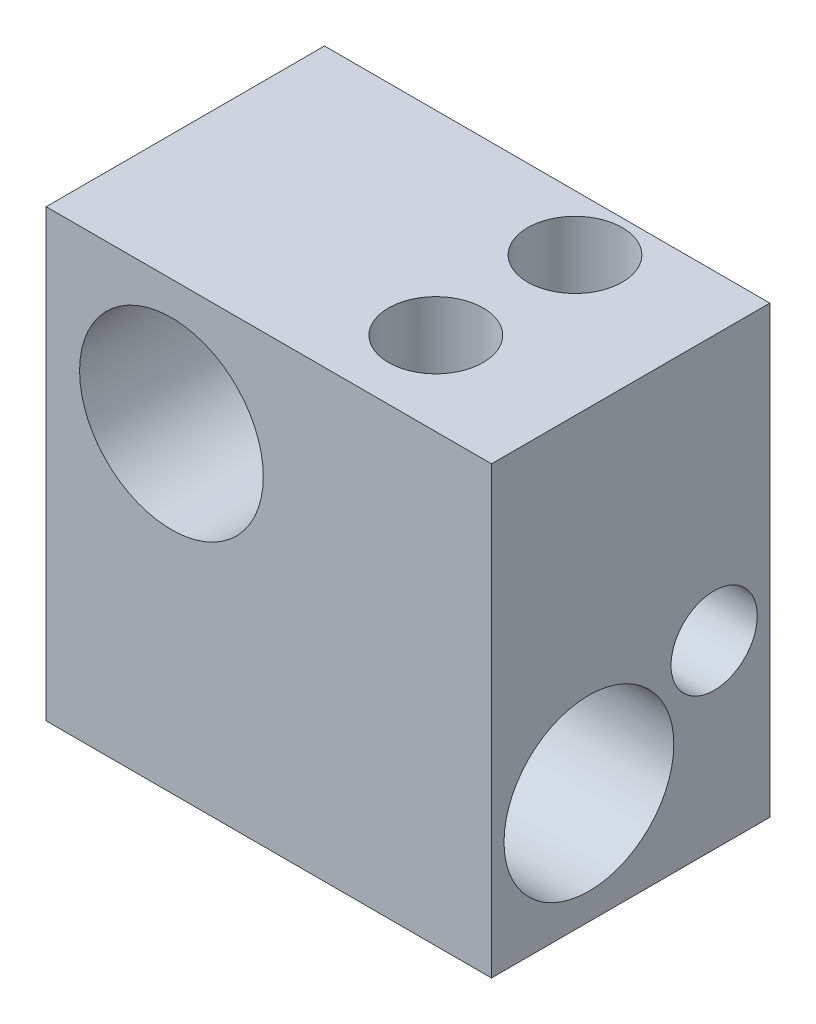
ISO-10303-21;
HEADER;
FILE_DESCRIPTION(('STEP AP214'),'2;1');
FILE_NAME('part.step','',(''),(''),'','','');
FILE_SCHEMA(('AUTOMOTIVE_DESIGN { 1 0 10303 214 1 1 1 1 }'));
ENDSEC;
DATA;
#1=APPLICATION_CONTEXT('core data for automotive mechanical design processes');
#2=APPLICATION_PROTOCOL_DEFINITION('international standard','automotive_design',2000,#1);
#3=PRODUCT_CONTEXT('',#1,'mechanical');
#4=PRODUCT('Part','Part','',(#3));
#5=PRODUCT_RELATED_PRODUCT_CATEGORY('part','',(#4));
#6=PRODUCT_DEFINITION_FORMATION('','',#4);
#7=PRODUCT_DEFINITION_CONTEXT('part definition',#1,'design');
#8=PRODUCT_DEFINITION('design','',#6,#7);
#9=PRODUCT_DEFINITION_SHAPE('','',#8);
#10=(LENGTH_UNIT() NAMED_UNIT(*) SI_UNIT(.MILLI.,.METRE.));
#11=(NAMED_UNIT(*) PLANE_ANGLE_UNIT() SI_UNIT($,.RADIAN.));
#12=(NAMED_UNIT(*) SI_UNIT($,.STERADIAN.) SOLID_ANGLE_UNIT());
#13=UNCERTAINTY_MEASURE_WITH_UNIT(LENGTH_MEASURE(1.E-05),#10,'distance_accuracy_value','');
#14=(GEOMETRIC_REPRESENTATION_CONTEXT(3) GLOBAL_UNCERTAINTY_ASSIGNED_CONTEXT((#13)) GLOBAL_UNIT_ASSIGNED_CONTEXT((#10,
#11,#12)) REPRESENTATION_CONTEXT('',''));
#15=CARTESIAN_POINT('',(0.,0.,0.));
#16=DIRECTION('',(0.,0.,1.));
#17=DIRECTION('',(1.,0.,0.));
#18=AXIS2_PLACEMENT_3D('',#15,#16,#17);
#19=CARTESIAN_POINT('',(0.,0.,10.));
#20=DIRECTION('',(1.,0.,0.));
#21=DIRECTION('',(0.,0.,-1.));
#22=AXIS2_PLACEMENT_3D('',#19,#20,#21);
#23=PLANE('',#22);
#24=CARTESIAN_POINT('',(0.,6.5,2.));
#25=DIRECTION('',(1.,0.,0.));
#26=DIRECTION('',(0.,0.,-1.));
#27=AXIS2_PLACEMENT_3D('',#24,#25,#26);
#28=CIRCLE('',#27,1.55);
#29=CARTESIAN_POINT('',(0.,6.5,0.450000000000003));
#30=VERTEX_POINT('',#29);
#31=EDGE_CURVE('E222',#30,#30,#28,.T.);
#32=ORIENTED_EDGE('',*,*,#31,.T.);
#33=EDGE_LOOP('',(#32));
#34=FACE_BOUND('',#33,.T.);
#35=CARTESIAN_POINT('',(0.,4.,6.5));
#36=DIRECTION('',(1.,0.,0.));
#37=DIRECTION('',(0.,0.,-1.));
#38=AXIS2_PLACEMENT_3D('',#35,#36,#37);
#39=CIRCLE('',#38,3.05);
#40=CARTESIAN_POINT('',(0.,4.,3.45));
#41=VERTEX_POINT('',#40);
#42=EDGE_CURVE('E213',#41,#41,#39,.T.);
#43=ORIENTED_EDGE('',*,*,#42,.T.);
#44=EDGE_LOOP('',(#43));
#45=FACE_BOUND('',#44,.T.);
#46=DIRECTION('',(0.,-1.,0.));
#47=VECTOR('',#46,1.);
#48=CARTESIAN_POINT('',(0.,0.,0.));
#49=LINE('',#48,#47);
#50=CARTESIAN_POINT('',(0.,16.,0.));
#51=VERTEX_POINT('',#50);
#52=CARTESIAN_POINT('',(0.,0.,0.));
#53=VERTEX_POINT('',#52);
#54=EDGE_CURVE('E189',#51,#53,#49,.T.);
#55=ORIENTED_EDGE('',*,*,#54,.T.);
#56=DIRECTION('',(0.,0.,-1.));
#57=VECTOR('',#56,1.);
#58=CARTESIAN_POINT('',(0.,0.,10.));
#59=LINE('',#58,#57);
#60=CARTESIAN_POINT('',(0.,0.,10.));
#61=VERTEX_POINT('',#60);
#62=EDGE_CURVE('E115',#61,#53,#59,.T.);
#63=ORIENTED_EDGE('',*,*,#62,.F.);
#64=DIRECTION('',(0.,-1.,0.));
#65=VECTOR('',#64,1.);
#66=CARTESIAN_POINT('',(0.,0.,10.));
#67=LINE('',#66,#65);
#68=CARTESIAN_POINT('',(0.,16.,10.));
#69=VERTEX_POINT('',#68);
#70=EDGE_CURVE('E196',#69,#61,#67,.T.);
#71=ORIENTED_EDGE('',*,*,#70,.F.);
#72=DIRECTION('',(0.,0.,-1.));
#73=VECTOR('',#72,1.);
#74=CARTESIAN_POINT('',(0.,16.,10.));
#75=LINE('',#74,#73);
#76=EDGE_CURVE('E200',#69,#51,#75,.T.);
#77=ORIENTED_EDGE('',*,*,#76,.T.);
#78=EDGE_LOOP('',(#55,#63,#71,#77));
#79=FACE_BOUND('',#78,.T.);
#80=ADVANCED_FACE('F34',(#34,#45,#79),#23,.F.);
#81=CARTESIAN_POINT('',(0.,0.,10.));
#82=DIRECTION('',(0.,1.,0.));
#83=DIRECTION('',(0.,0.,1.));
#84=AXIS2_PLACEMENT_3D('',#81,#82,#83);
#85=PLANE('',#84);
#86=DIRECTION('',(1.,0.,0.));
#87=VECTOR('',#86,1.);
#88=CARTESIAN_POINT('',(0.,0.,0.));
#89=LINE('',#88,#87);
#90=CARTESIAN_POINT('',(16.,0.,0.));
#91=VERTEX_POINT('',#90);
#92=EDGE_CURVE('E179',#53,#91,#89,.T.);
#93=ORIENTED_EDGE('',*,*,#92,.T.);
#94=DIRECTION('',(0.,0.,-1.));
#95=VECTOR('',#94,1.);
#96=CARTESIAN_POINT('',(16.,0.,10.));
#97=LINE('',#96,#95);
#98=CARTESIAN_POINT('',(16.,0.,10.));
#99=VERTEX_POINT('',#98);
#100=EDGE_CURVE('E181',#99,#91,#97,.T.);
#101=ORIENTED_EDGE('',*,*,#100,.F.);
#102=DIRECTION('',(1.,0.,0.));
#103=VECTOR('',#102,1.);
#104=CARTESIAN_POINT('',(0.,0.,10.));
#105=LINE('',#104,#103);
#106=EDGE_CURVE('E91',#61,#99,#105,.T.);
#107=ORIENTED_EDGE('',*,*,#106,.F.);
#108=ORIENTED_EDGE('',*,*,#62,.T.);
#109=EDGE_LOOP('',(#93,#101,#107,#108));
#110=FACE_BOUND('',#109,.T.);
#111=ADVANCED_FACE('F172',(#110),#85,.F.);
#112=CARTESIAN_POINT('',(16.,0.,10.));
#113=DIRECTION('',(-1.,0.,0.));
#114=DIRECTION('',(0.,0.,1.));
#115=AXIS2_PLACEMENT_3D('',#112,#113,#114);
#116=PLANE('',#115);
#117=CARTESIAN_POINT('',(16.,6.5,2.));
#118=DIRECTION('',(1.,0.,0.));
#119=DIRECTION('',(0.,0.,-1.));
#120=AXIS2_PLACEMENT_3D('',#117,#118,#119);
#121=CIRCLE('',#120,1.55);
#122=CARTESIAN_POINT('',(16.,6.5,0.450000000000002));
#123=VERTEX_POINT('',#122);
#124=EDGE_CURVE('E146',#123,#123,#121,.T.);
#125=ORIENTED_EDGE('',*,*,#124,.F.);
#126=EDGE_LOOP('',(#125));
#127=FACE_BOUND('',#126,.T.);
#128=CARTESIAN_POINT('',(16.,4.,6.5));
#129=DIRECTION('',(1.,0.,0.));
#130=DIRECTION('',(0.,0.,-1.));
#131=AXIS2_PLACEMENT_3D('',#128,#129,#130);
#132=CIRCLE('',#131,3.05);
#133=CARTESIAN_POINT('',(16.,4.,3.45));
#134=VERTEX_POINT('',#133);
#135=EDGE_CURVE('E219',#134,#134,#132,.T.);
#136=ORIENTED_EDGE('',*,*,#135,.F.);
#137=EDGE_LOOP('',(#136));
#138=FACE_BOUND('',#137,.T.);
#139=DIRECTION('',(0.,1.,0.));
#140=VECTOR('',#139,1.);
#141=CARTESIAN_POINT('',(16.,0.,0.));
#142=LINE('',#141,#140);
#143=CARTESIAN_POINT('',(16.,16.,0.));
#144=VERTEX_POINT('',#143);
#145=EDGE_CURVE('E188',#91,#144,#142,.T.);
#146=ORIENTED_EDGE('',*,*,#145,.T.);
#147=DIRECTION('',(0.,0.,-1.));
#148=VECTOR('',#147,1.);
#149=CARTESIAN_POINT('',(16.,16.,10.));
#150=LINE('',#149,#148);
#151=CARTESIAN_POINT('',(16.,16.,10.));
#152=VERTEX_POINT('',#151);
#153=EDGE_CURVE('E194',#152,#144,#150,.T.);
#154=ORIENTED_EDGE('',*,*,#153,.F.);
#155=DIRECTION('',(0.,1.,0.));
#156=VECTOR('',#155,1.);
#157=CARTESIAN_POINT('',(16.,0.,10.));
#158=LINE('',#157,#156);
#159=EDGE_CURVE('E193',#99,#152,#158,.T.);
#160=ORIENTED_EDGE('',*,*,#159,.F.);
#161=ORIENTED_EDGE('',*,*,#100,.T.);
#162=EDGE_LOOP('',(#146,#154,#160,#161));
#163=FACE_BOUND('',#162,.T.);
#164=ADVANCED_FACE('F169',(#127,#138,#163),#116,.F.);
#165=CARTESIAN_POINT('',(0.,16.,10.));
#166=DIRECTION('',(0.,-1.,0.));
#167=DIRECTION('',(0.,0.,-1.));
#168=AXIS2_PLACEMENT_3D('',#165,#166,#167);
#169=PLANE('',#168);
#170=CARTESIAN_POINT('',(11.,16.,2.));
#171=DIRECTION('',(0.,1.,0.));
#172=DIRECTION('',(0.,0.,1.));
#173=AXIS2_PLACEMENT_3D('',#170,#171,#172);
#174=CIRCLE('',#173,1.69999999999999);
#175=CARTESIAN_POINT('',(11.,16.,3.69999999999999));
#176=VERTEX_POINT('',#175);
#177=EDGE_CURVE('E109',#176,#176,#174,.T.);
#178=ORIENTED_EDGE('',*,*,#177,.F.);
#179=EDGE_LOOP('',(#178));
#180=FACE_BOUND('',#179,.T.);
#181=CARTESIAN_POINT('',(11.,16.,7.));
#182=DIRECTION('',(0.,1.,0.));
#183=DIRECTION('',(0.,0.,1.));
#184=AXIS2_PLACEMENT_3D('',#181,#182,#183);
#185=CIRCLE('',#184,1.69999999999999);
#186=CARTESIAN_POINT('',(11.,16.,8.69999999999999));
#187=VERTEX_POINT('',#186);
#188=EDGE_CURVE('E147',#187,#187,#185,.T.);
#189=ORIENTED_EDGE('',*,*,#188,.F.);
#190=EDGE_LOOP('',(#189));
#191=FACE_BOUND('',#190,.T.);
#192=DIRECTION('',(-1.,0.,0.));
#193=VECTOR('',#192,1.);
#194=CARTESIAN_POINT('',(0.,16.,0.));
#195=LINE('',#194,#193);
#196=EDGE_CURVE('E83',#144,#51,#195,.T.);
#197=ORIENTED_EDGE('',*,*,#196,.T.);
#198=ORIENTED_EDGE('',*,*,#76,.F.);
#199=DIRECTION('',(-1.,0.,0.));
#200=VECTOR('',#199,1.);
#201=CARTESIAN_POINT('',(0.,16.,10.));
#202=LINE('',#201,#200);
#203=EDGE_CURVE('E62',#152,#69,#202,.T.);
#204=ORIENTED_EDGE('',*,*,#203,.F.);
#205=ORIENTED_EDGE('',*,*,#153,.T.);
#206=EDGE_LOOP('',(#197,#198,#204,#205));
#207=FACE_BOUND('',#206,.T.);
#208=ADVANCED_FACE('F162',(#180,#191,#207),#169,.F.);
#209=CARTESIAN_POINT('',(0.,0.,10.));
#210=DIRECTION('',(0.,0.,-1.));
#211=DIRECTION('',(-1.,0.,0.));
#212=AXIS2_PLACEMENT_3D('',#209,#210,#211);
#213=PLANE('',#212);
#214=CARTESIAN_POINT('',(4.5,11.5,10.));
#215=DIRECTION('',(0.,0.,1.));
#216=DIRECTION('',(1.,0.,0.));
#217=AXIS2_PLACEMENT_3D('',#214,#215,#216);
#218=CIRCLE('',#217,3.3);
#219=CARTESIAN_POINT('',(7.8,11.5,10.));
#220=VERTEX_POINT('',#219);
#221=EDGE_CURVE('E209',#220,#220,#218,.T.);
#222=ORIENTED_EDGE('',*,*,#221,.F.);
#223=EDGE_LOOP('',(#222));
#224=FACE_BOUND('',#223,.T.);
#225=ORIENTED_EDGE('',*,*,#70,.T.);
#226=ORIENTED_EDGE('',*,*,#106,.T.);
#227=ORIENTED_EDGE('',*,*,#159,.T.);
#228=ORIENTED_EDGE('',*,*,#203,.T.);
#229=EDGE_LOOP('',(#225,#226,#227,#228));
#230=FACE_BOUND('',#229,.T.);
#231=ADVANCED_FACE('F159',(#224,#230),#213,.F.);
#232=CARTESIAN_POINT('',(0.,0.,0.));
#233=DIRECTION('',(0.,0.,-1.));
#234=DIRECTION('',(-1.,0.,0.));
#235=AXIS2_PLACEMENT_3D('',#232,#233,#234);
#236=PLANE('',#235);
#237=CARTESIAN_POINT('',(4.5,11.5,0.));
#238=DIRECTION('',(0.,0.,1.));
#239=DIRECTION('',(1.,0.,0.));
#240=AXIS2_PLACEMENT_3D('',#237,#238,#239);
#241=CIRCLE('',#240,3.3);
#242=CARTESIAN_POINT('',(7.8,11.5,0.));
#243=VERTEX_POINT('',#242);
#244=EDGE_CURVE('E206',#243,#243,#241,.T.);
#245=ORIENTED_EDGE('',*,*,#244,.T.);
#246=EDGE_LOOP('',(#245));
#247=FACE_BOUND('',#246,.T.);
#248=ORIENTED_EDGE('',*,*,#54,.F.);
#249=ORIENTED_EDGE('',*,*,#196,.F.);
#250=ORIENTED_EDGE('',*,*,#145,.F.);
#251=ORIENTED_EDGE('',*,*,#92,.F.);
#252=EDGE_LOOP('',(#248,#249,#250,#251));
#253=FACE_BOUND('',#252,.T.);
#254=ADVANCED_FACE('F157',(#247,#253),#236,.T.);
#255=CARTESIAN_POINT('',(4.5,11.5,10.));
#256=DIRECTION('',(0.,0.,1.));
#257=DIRECTION('',(1.,0.,0.));
#258=AXIS2_PLACEMENT_3D('',#255,#256,#257);
#259=CYLINDRICAL_SURFACE('',#258,3.3);
#260=ORIENTED_EDGE('',*,*,#244,.F.);
#261=EDGE_LOOP('',(#260));
#262=FACE_BOUND('',#261,.T.);
#263=ORIENTED_EDGE('',*,*,#221,.T.);
#264=EDGE_LOOP('',(#263));
#265=FACE_BOUND('',#264,.T.);
#266=ADVANCED_FACE('F153',(#262,#265),#259,.F.);
#267=CARTESIAN_POINT('',(16.,4.,6.5));
#268=DIRECTION('',(1.,0.,0.));
#269=DIRECTION('',(0.,0.,-1.));
#270=AXIS2_PLACEMENT_3D('',#267,#268,#269);
#271=CYLINDRICAL_SURFACE('',#270,3.05);
#272=CARTESIAN_POINT('',(11.,6.11246301742777,8.69999999999999));
#273=CARTESIAN_POINT('',(11.079528292114,6.11246521704666,8.69999880663125));
#274=CARTESIAN_POINT('',(11.1590626536137,6.11837709360835,8.69436634365375));
#275=CARTESIAN_POINT('',(11.3151203009329,6.14088413708846,8.67240519859406));
#276=CARTESIAN_POINT('',(11.3916378112338,6.15749883107021,8.65605696485787));
#277=CARTESIAN_POINT('',(11.5387751049102,6.19855788811439,8.61416202924386));
#278=CARTESIAN_POINT('',(11.6094515040304,6.22291216169066,8.58872076598859));
#279=CARTESIAN_POINT('',(11.7451636340388,6.2768644990575,8.52977531960098));
#280=CARTESIAN_POINT('',(11.8101958631759,6.30646578403713,8.49626617897));
#281=CARTESIAN_POINT('',(11.9625058895438,6.38276584472862,8.40521710895298));
#282=CARTESIAN_POINT('',(12.0465534873438,6.43114532893025,8.34366111778082));
#283=CARTESIAN_POINT('',(12.2018539996193,6.52914577283632,8.20676312037032));
#284=CARTESIAN_POINT('',(12.2730863231075,6.57876858708926,8.13139931361466));
#285=CARTESIAN_POINT('',(12.4018464546333,6.67554138933424,7.96734673095226));
#286=CARTESIAN_POINT('',(12.4592853829597,6.72267388964667,7.87857724132457));
#287=CARTESIAN_POINT('',(12.5575415393918,6.81042296670274,7.68946469682761));
#288=CARTESIAN_POINT('',(12.5983941357671,6.85105329514796,7.58914686035655));
#289=CARTESIAN_POINT('',(12.6535101455393,6.91429007678262,7.40370552398925));
#290=CARTESIAN_POINT('',(12.671738304028,6.93889171536477,7.32043563644801));
#291=CARTESIAN_POINT('',(12.6955057504751,6.98113370461356,7.15038014182077));
#292=CARTESIAN_POINT('',(12.7010530909569,6.99877846711341,7.06359680149102));
#293=CARTESIAN_POINT('',(12.6986124283513,7.02642753294553,6.88871235423095));
#294=CARTESIAN_POINT('',(12.6905828288487,7.03640821912031,6.80060802022368));
#295=CARTESIAN_POINT('',(12.6607540185029,7.04864142539075,6.62620672537741));
#296=CARTESIAN_POINT('',(12.6389539614247,7.05089347048402,6.53990987595039));
#297=CARTESIAN_POINT('',(12.58361183566,7.04852924800228,6.37607526733101));
#298=CARTESIAN_POINT('',(12.5507057179934,7.04424806801717,6.29831536252761));
#299=CARTESIAN_POINT('',(12.4739888344927,7.0306510828756,6.14887335927377));
#300=CARTESIAN_POINT('',(12.4301761928093,7.02133441132504,6.07719230919201));
#301=CARTESIAN_POINT('',(12.3300495489403,6.99857575805711,5.93756806307858));
#302=CARTESIAN_POINT('',(12.2731684968729,6.98493019979587,5.87006579594821));
#303=CARTESIAN_POINT('',(12.1499047478196,6.95573389097036,5.74483125871357));
#304=CARTESIAN_POINT('',(12.083516653548,6.94018205891422,5.68710457926041));
#305=CARTESIAN_POINT('',(11.9363801181384,6.90788541207189,5.57792262875148));
#306=CARTESIAN_POINT('',(11.8548816903996,6.89115627174879,5.52746865366277));
#307=CARTESIAN_POINT('',(11.6841311855808,6.86054243141176,5.4407926754854));
#308=CARTESIAN_POINT('',(11.5948799232641,6.84665743301417,5.40456917908717));
#309=CARTESIAN_POINT('',(11.4111970273088,6.82411577992966,5.34769171207569));
#310=CARTESIAN_POINT('',(11.3167832631293,6.81544219905549,5.32698728218171));
#311=CARTESIAN_POINT('',(11.1254647779462,6.80486147604216,5.30189766698735));
#312=CARTESIAN_POINT('',(11.0285617221608,6.80294992334307,5.29750184424141));
#313=CARTESIAN_POINT('',(10.8428385303602,6.80611754199839,5.30492351648954));
#314=CARTESIAN_POINT('',(10.7539586678158,6.81068169859903,5.31554634499857));
#315=CARTESIAN_POINT('',(10.5793763545709,6.82513614190086,5.35045338371066));
#316=CARTESIAN_POINT('',(10.4936746091361,6.83502760332955,5.37474060711116));
#317=CARTESIAN_POINT('',(10.3269117113306,6.85872202560501,5.43637495339453));
#318=CARTESIAN_POINT('',(10.2458936868882,6.87255596848563,5.47382609194977));
#319=CARTESIAN_POINT('',(10.0909383208469,6.90213194711119,5.5607275277258));
#320=CARTESIAN_POINT('',(10.0170040152766,6.91787479450734,5.61018293808523));
#321=CARTESIAN_POINT('',(9.87231802137184,6.95034526170827,5.72428055641386));
#322=CARTESIAN_POINT('',(9.80225100699768,6.96705524547497,5.78979957867765));
#323=CARTESIAN_POINT('',(9.67382864707653,6.99754129352491,5.93208144126689));
#324=CARTESIAN_POINT('',(9.61547351412429,7.01131730455079,6.00884448565076));
#325=CARTESIAN_POINT('',(9.51255251487534,7.03334033550922,6.17132974724012));
#326=CARTESIAN_POINT('',(9.46791775320684,7.04161523089308,6.25700421112762));
#327=CARTESIAN_POINT('',(9.39374404126914,7.050604666509,6.43500750946291));
#328=CARTESIAN_POINT('',(9.3641920460077,7.05132575056311,6.5273305144853));
#329=CARTESIAN_POINT('',(9.32320482779211,7.04418985049511,6.70668203006624));
#330=CARTESIAN_POINT('',(9.31035870384708,7.03711214325876,6.79342145747231));
#331=CARTESIAN_POINT('',(9.29810147563808,7.01532115680955,6.96687529372333));
#332=CARTESIAN_POINT('',(9.29868872327855,7.00060881448105,7.05358970433211));
#333=CARTESIAN_POINT('',(9.3124449362777,6.96466819995405,7.22135298471635));
#334=CARTESIAN_POINT('',(9.32516776202245,6.94368903511258,7.30249374719761));
#335=CARTESIAN_POINT('',(9.36154830217017,6.89599211310626,7.46049351612934));
#336=CARTESIAN_POINT('',(9.38520845599848,6.86927307645147,7.53735156308978));
#337=CARTESIAN_POINT('',(9.44485454495917,6.80871934941205,7.69209957936243));
#338=CARTESIAN_POINT('',(9.48175140399204,6.77446261778025,7.76947050297494));
#339=CARTESIAN_POINT('',(9.56576526861032,6.70230757727452,7.9166025137268));
#340=CARTESIAN_POINT('',(9.61289050318388,6.66440635006594,7.98635740526089));
#341=CARTESIAN_POINT('',(9.72468156212294,6.58051744926257,8.12827342879236));
#342=CARTESIAN_POINT('',(9.79095309759887,6.53421611376738,8.19898573556621));
#343=CARTESIAN_POINT('',(9.93485267899358,6.44243383026492,8.32847161079104));
#344=CARTESIAN_POINT('',(10.0124840622316,6.39695312777073,8.38724165865949));
#345=CARTESIAN_POINT('',(10.1641828747792,6.31842475223448,8.48255767093629));
#346=CARTESIAN_POINT('',(10.2365265697154,6.28458976690715,8.52119080734116));
#347=CARTESIAN_POINT('',(10.388332235136,6.22340472754376,8.58830863110985));
#348=CARTESIAN_POINT('',(10.4677827075826,6.1960444505328,8.61680935286561));
#349=CARTESIAN_POINT('',(10.6219564682311,6.15443249980622,8.65909567266765));
#350=CARTESIAN_POINT('',(10.69593446831,6.13893272301315,8.67432034614318));
#351=CARTESIAN_POINT('',(10.8466096104982,6.11795530601941,8.69476471439925));
#352=CARTESIAN_POINT('',(10.9233019827117,6.11246089608952,8.7000011508988));
#353=CARTESIAN_POINT('',(11.,6.11246301742777,8.69999999999999));
#354=B_SPLINE_CURVE_WITH_KNOTS('',3,(#272,#273,#274,#275,#276,#277,#278,#279,#280,#281,#282,
#283,#284,#285,#286,#287,#288,#289,#290,#291,#292,#293,#294,#295,#296,#297,#298,#299,#300,#301,
#302,#303,#304,#305,#306,#307,#308,#309,#310,#311,#312,#313,#314,#315,#316,#317,#318,#319,#320,
#321,#322,#323,#324,#325,#326,#327,#328,#329,#330,#331,#332,#333,#334,#335,#336,#337,#338,#339,
#340,#341,#342,#343,#344,#345,#346,#347,#348,#349,#350,#351,#352,#353),.UNSPECIFIED.,.T.,.F.,(4,
2,2,2,2,2,2,2,2,2,2,2,2,2,2,2,2,2,2,2,2,2,2,2,2,2,2,2,2,2,2,2,2,2,2,2,2,2,2,2,4),(0.,
0.238219706217413,0.476875274959469,0.712848793102822,0.948967682504307,1.29180488978264,
1.63518812580302,1.98072795120549,2.32552703679465,2.59056206253207,2.85542873995769,
3.12110837513352,3.38680433869112,3.63932339493042,3.891885912805,4.1587377535882,
4.42574169507851,4.71628058324288,5.00678897485979,5.29634864949729,5.5857194228192,
5.8533242382082,6.12098808748569,6.39081629425105,6.66075963482893,6.95151187399577,
7.24226939043726,7.53154210579725,7.8205642051714,8.08312638473309,8.34565635158917,
8.59889253110613,8.8521852188512,9.12806285008097,9.40416326006329,9.72510101188163,
10.0461332394492,10.3113949940656,10.5762350876273,10.8063630327356,11.0361049102513),.UNSPECIFIED.);
#355=CARTESIAN_POINT('',(11.,6.11246301742777,8.69999999999999));
#356=VERTEX_POINT('',#355);
#357=EDGE_CURVE('E141',#356,#356,#354,.T.);
#358=ORIENTED_EDGE('',*,*,#357,.T.);
#359=EDGE_LOOP('',(#358));
#360=FACE_BOUND('',#359,.T.);
#361=ORIENTED_EDGE('',*,*,#42,.F.);
#362=EDGE_LOOP('',(#361));
#363=FACE_BOUND('',#362,.T.);
#364=ORIENTED_EDGE('',*,*,#135,.T.);
#365=EDGE_LOOP('',(#364));
#366=FACE_BOUND('',#365,.T.);
#367=ADVANCED_FACE('F149',(#360,#363,#366),#271,.F.);
#368=CARTESIAN_POINT('',(16.,6.5,2.));
#369=DIRECTION('',(1.,0.,0.));
#370=DIRECTION('',(0.,0.,-1.));
#371=AXIS2_PLACEMENT_3D('',#368,#369,#370);
#372=CYLINDRICAL_SURFACE('',#371,1.55);
#373=CARTESIAN_POINT('',(9.94827771819484,6.60234630523538,3.54661735209607));
#374=CARTESIAN_POINT('',(10.0299656688973,6.57568227244496,3.54840889569701));
#375=CARTESIAN_POINT('',(10.1122652090139,6.55056064690307,3.54934879083229));
#376=CARTESIAN_POINT('',(10.2785502456609,6.50491914385614,3.55015468796112));
#377=CARTESIAN_POINT('',(10.3625419744983,6.4844221283573,3.55001547005809));
#378=CARTESIAN_POINT('',(10.5292217747943,6.45038046759996,3.54929881814538));
#379=CARTESIAN_POINT('',(10.6118677733713,6.43663744896011,3.54873530333735));
#380=CARTESIAN_POINT('',(10.7779065902678,6.41680590261879,3.5477984257178));
#381=CARTESIAN_POINT('',(10.8612971107623,6.41069888845728,3.54742460497464));
#382=CARTESIAN_POINT('',(11.0371718992332,6.4068059935756,3.54719925119759));
#383=CARTESIAN_POINT('',(11.1296798647334,6.40997441458367,3.54740750881582));
#384=CARTESIAN_POINT('',(11.3140342162988,6.42617369164665,3.54825922168896));
#385=CARTESIAN_POINT('',(11.4058779817686,6.43923249477384,3.54890390960796));
#386=CARTESIAN_POINT('',(11.5913022165607,6.47380600230316,3.54987609879391));
#387=CARTESIAN_POINT('',(11.6848275045954,6.49560613817351,3.55019144523578));
#388=CARTESIAN_POINT('',(11.8236161069713,6.53273879991537,3.54970366436819));
#389=CARTESIAN_POINT('',(11.869511132841,6.54581520762023,3.54938301695424));
#390=CARTESIAN_POINT('',(11.960901326876,6.57320855955565,3.54833119604422));
#391=CARTESIAN_POINT('',(12.0063966790116,6.5875248961046,3.54760022269432));
#392=CARTESIAN_POINT('',(12.051722281803,6.60234630523469,3.54661735209612));
#393=B_SPLINE_CURVE_WITH_KNOTS('',3,(#373,#374,#375,#376,#377,#378,#379,#380,#381,#382,#383,
#384,#385,#386,#387,#388,#389,#390,#391,#392),.UNSPECIFIED.,.F.,.F.,(4,2,2,2,2,2,2,2,2,4),(0.,
0.257956947137534,0.517162462152992,0.768216193190266,1.0186609489628,1.29574771271967,
1.57362037024624,1.86142043578096,2.00457447535001,2.14765874875762),.UNSPECIFIED.);
#394=CARTESIAN_POINT('',(10.3017879978116,6.50000000000001,3.55));
#395=VERTEX_POINT('',#394);
#396=CARTESIAN_POINT('',(11.6982120021884,6.50000000000001,3.55));
#397=VERTEX_POINT('',#396);
#398=EDGE_CURVE('E107',#395,#397,#393,.T.);
#399=ORIENTED_EDGE('',*,*,#398,.T.);
#400=CARTESIAN_POINT('',(11.6982120021884,6.50000000000001,3.55));
#401=CARTESIAN_POINT('',(11.6981914217763,6.52268598619433,3.55000461302296));
#402=CARTESIAN_POINT('',(11.699318696116,6.54535032992333,3.54950177802686));
#403=CARTESIAN_POINT('',(11.7036849604538,6.59036740589911,3.54752594545021));
#404=CARTESIAN_POINT('',(11.706917745378,6.6127208572772,3.54605579846982));
#405=CARTESIAN_POINT('',(11.7193474724829,6.67825420940596,3.54033165289019));
#406=CARTESIAN_POINT('',(11.731290393373,6.72080163974979,3.53476008981329));
#407=CARTESIAN_POINT('',(11.7677595134151,6.82470467507449,3.51694506335921));
#408=CARTESIAN_POINT('',(11.7955982345659,6.88448772405842,3.50274426212564));
#409=CARTESIAN_POINT('',(11.857252228671,6.99977171134,3.46846522534499));
#410=CARTESIAN_POINT('',(11.8911346932295,7.05521321281564,3.4483190458793));
#411=CARTESIAN_POINT('',(11.9574758322685,7.15614352817573,3.40521553878848));
#412=CARTESIAN_POINT('',(11.9896701365686,7.20205205807905,3.38282436279619));
#413=CARTESIAN_POINT('',(12.0547198464618,7.29110915069831,3.3338776093308));
#414=CARTESIAN_POINT('',(12.0875756779279,7.33425585555374,3.30731926923697));
#415=CARTESIAN_POINT('',(12.1854626591099,7.45945824489579,3.22154105785228));
#416=CARTESIAN_POINT('',(12.2501153054194,7.53770319267053,3.15603432583387));
#417=CARTESIAN_POINT('',(12.3573042791835,7.66428654349635,3.02614660793081));
#418=CARTESIAN_POINT('',(12.401346865452,7.71522743041174,2.96552226497755));
#419=CARTESIAN_POINT('',(12.4831770789744,7.80875322787809,2.83434486477702));
#420=CARTESIAN_POINT('',(12.5209730250927,7.85134926580211,2.7638052476711));
#421=CARTESIAN_POINT('',(12.58093286617,7.91845823276295,2.62847649920338));
#422=CARTESIAN_POINT('',(12.6047113136818,7.94488390177252,2.56535799048199));
#423=CARTESIAN_POINT('',(12.6450717647996,7.98958198760009,2.4340968402316));
#424=CARTESIAN_POINT('',(12.6616585374202,8.00785980772731,2.36595756331099));
#425=CARTESIAN_POINT('',(12.6864391659554,8.03512527815986,2.22585482562954));
#426=CARTESIAN_POINT('',(12.6945787535742,8.04405286191388,2.15386972423616));
#427=CARTESIAN_POINT('',(12.7015220903269,8.05167014597322,2.00891560657133));
#428=CARTESIAN_POINT('',(12.7003294250256,8.05036377828659,1.93594697893866));
#429=CARTESIAN_POINT('',(12.6893425826923,8.0383052819556,1.79914381422978));
#430=CARTESIAN_POINT('',(12.6804485850891,8.02854165072544,1.73514363930578));
#431=CARTESIAN_POINT('',(12.6559124277865,8.00152514854609,1.6101081703234));
#432=CARTESIAN_POINT('',(12.6402690268133,7.98427090000364,1.54907342393144));
#433=CARTESIAN_POINT('',(12.6023026420481,7.94220672031363,1.4283132131561));
#434=CARTESIAN_POINT('',(12.5796944125863,7.9170731090007,1.36879214470456));
#435=CARTESIAN_POINT('',(12.5293621356042,7.860737651246,1.25506564339451));
#436=CARTESIAN_POINT('',(12.5016358706848,7.82953317427237,1.20086253019937));
#437=CARTESIAN_POINT('',(12.42658251559,7.74428541677706,1.07098586974481));
#438=CARTESIAN_POINT('',(12.3766221164069,7.68686823275254,0.999036118795841));
#439=CARTESIAN_POINT('',(12.2712094266769,7.56280105079905,0.868128131553292));
#440=CARTESIAN_POINT('',(12.21574013384,7.49612219894493,0.809212048411361));
#441=CARTESIAN_POINT('',(12.1015192627514,7.35311970778442,0.702754600996295));
#442=CARTESIAN_POINT('',(12.042720734007,7.27660166905338,0.655523109122833));
#443=CARTESIAN_POINT('',(11.9570886316339,7.15522035212282,0.594574241113616));
#444=CARTESIAN_POINT('',(11.9289806702998,7.11367334162243,0.575912005356927));
#445=CARTESIAN_POINT('',(11.8747459031173,7.02800504032989,0.541975840908386));
#446=CARTESIAN_POINT('',(11.848616814822,6.98388682246474,0.526697968254304));
#447=CARTESIAN_POINT('',(11.8024474967555,6.89703755504331,0.501098498966334));
#448=CARTESIAN_POINT('',(11.7820614632094,6.85459457041814,0.490437836014427));
#449=CARTESIAN_POINT('',(11.7465007246971,6.76709872438997,0.47254098454695));
#450=CARTESIAN_POINT('',(11.7312914417845,6.72206562670452,0.46528194701289));
#451=CARTESIAN_POINT('',(11.7130582636869,6.64733091943718,0.45675276776334));
#452=CARTESIAN_POINT('',(11.7075980749927,6.61837505711228,0.454253438173245));
#453=CARTESIAN_POINT('',(11.700126586784,6.55963972489114,0.450861901726223));
#454=CARTESIAN_POINT('',(11.6981507949189,6.52985488253927,0.449986236197275));
#455=CARTESIAN_POINT('',(11.6982120021884,6.50000000000001,0.450000000000002));
#456=B_SPLINE_CURVE_WITH_KNOTS('',3,(#400,#401,#402,#403,#404,#405,#406,#407,#408,#409,#410,
#411,#412,#413,#414,#415,#416,#417,#418,#419,#420,#421,#422,#423,#424,#425,#426,#427,#428,#429,
#430,#431,#432,#433,#434,#435,#436,#437,#438,#439,#440,#441,#442,#443,#444,#445,#446,#447,#448,
#449,#450,#451,#452,#453,#454,#455),.UNSPECIFIED.,.F.,.F.,(4,2,2,2,2,2,2,2,2,2,2,2,2,2,2,2,2,2,
2,2,2,2,2,2,2,2,2,4),(0.,0.0679880263963464,0.135776588880196,0.268718552951951,
0.469987870242309,0.67365278021991,0.854546468464115,1.03556059082536,1.39594408073677,
1.6668732000041,1.93743855454298,2.15390125594207,2.37022019409141,2.58792041185605,
2.80553699066454,3.00070042707982,3.19589977105681,3.40049387981203,3.60517683830604,
3.91764120957741,4.23110183232449,4.55215041843056,4.71257359006451,4.87280881766522,
5.01733446022883,5.16087488060436,5.24935071157612,5.33872305362311),.UNSPECIFIED.);
#457=CARTESIAN_POINT('',(11.6982120021884,6.50000000000001,0.450000000000003));
#458=VERTEX_POINT('',#457);
#459=EDGE_CURVE('E11',#397,#458,#456,.T.);
#460=ORIENTED_EDGE('',*,*,#459,.T.);
#461=CARTESIAN_POINT('',(12.051722281803,6.60234630523469,0.453382647903884));
#462=CARTESIAN_POINT('',(11.9700343311006,6.57568227244432,0.451591104302963));
#463=CARTESIAN_POINT('',(11.8877347909841,6.55056064690247,0.450651209167695));
#464=CARTESIAN_POINT('',(11.7214497543371,6.50491914385564,0.449845312038879));
#465=CARTESIAN_POINT('',(11.6374580254998,6.48442212835686,0.449984529941918));
#466=CARTESIAN_POINT('',(11.4707782252039,6.45038046759963,0.450701181854627));
#467=CARTESIAN_POINT('',(11.3881322266269,6.43663744895984,0.451264696662664));
#468=CARTESIAN_POINT('',(11.2220934097305,6.41680590261864,0.452201574282204));
#469=CARTESIAN_POINT('',(11.1387028892361,6.41069888845718,0.452575395025365));
#470=CARTESIAN_POINT('',(10.9628281007651,6.40680599357562,0.452800748802411));
#471=CARTESIAN_POINT('',(10.8703201352648,6.40997441458376,0.452592491184175));
#472=CARTESIAN_POINT('',(10.6859657836994,6.42617369164687,0.451740778311028));
#473=CARTESIAN_POINT('',(10.5941220182296,6.43923249477413,0.451096090392029));
#474=CARTESIAN_POINT('',(10.4086977834373,6.47380600230357,0.450123901206081));
#475=CARTESIAN_POINT('',(10.3151724954026,6.49560613817398,0.449808554764222));
#476=CARTESIAN_POINT('',(10.1763838930267,6.53273879991593,0.450296335631822));
#477=CARTESIAN_POINT('',(10.130488867157,6.54581520762082,0.450616983045778));
#478=CARTESIAN_POINT('',(10.0390986731219,6.57320855955628,0.451668803955806));
#479=CARTESIAN_POINT('',(9.99360332098631,6.58752489610527,0.452399777305719));
#480=CARTESIAN_POINT('',(9.94827771819485,6.60234630523538,0.45338264790393));
#481=B_SPLINE_CURVE_WITH_KNOTS('',3,(#461,#462,#463,#464,#465,#466,#467,#468,#469,#470,#471,
#472,#473,#474,#475,#476,#477,#478,#479,#480),.UNSPECIFIED.,.F.,.F.,(4,2,2,2,2,2,2,2,2,4),(0.,
0.257956947137381,0.517162462152685,0.768216193189812,1.01866094896221,1.29574771271922,
1.57362037024593,1.8614204357808,2.00457447534993,2.14765874875762),.UNSPECIFIED.);
#482=CARTESIAN_POINT('',(10.3017879978116,6.50000000000001,0.450000000000003));
#483=VERTEX_POINT('',#482);
#484=EDGE_CURVE('E46',#458,#483,#481,.T.);
#485=ORIENTED_EDGE('',*,*,#484,.T.);
#486=CARTESIAN_POINT('',(10.3017879978116,6.50000000000001,0.450000000000003));
#487=CARTESIAN_POINT('',(10.3018085782237,6.52268598619433,0.44999538697704));
#488=CARTESIAN_POINT('',(10.300681303884,6.54535032992333,0.450498221973143));
#489=CARTESIAN_POINT('',(10.2963150395462,6.59036740589911,0.452474054549787));
#490=CARTESIAN_POINT('',(10.293082254622,6.6127208572772,0.453944201530175));
#491=CARTESIAN_POINT('',(10.2806525275171,6.67825420940596,0.459668347109811));
#492=CARTESIAN_POINT('',(10.268709606627,6.72080163974979,0.465239910186708));
#493=CARTESIAN_POINT('',(10.2322404865849,6.82470467507449,0.483054936640785));
#494=CARTESIAN_POINT('',(10.2044017654341,6.88448772405842,0.497255737874364));
#495=CARTESIAN_POINT('',(10.142747771329,6.99977171134,0.531534774655006));
#496=CARTESIAN_POINT('',(10.1088653067705,7.05521321281564,0.551680954120696));
#497=CARTESIAN_POINT('',(10.0425241677315,7.15614352817573,0.594784461211525));
#498=CARTESIAN_POINT('',(10.0103298634314,7.20205205807906,0.617175637203814));
#499=CARTESIAN_POINT('',(9.94528015353822,7.29110915069831,0.666122390669205));
#500=CARTESIAN_POINT('',(9.91242432207208,7.33425585555374,0.692680730763026));
#501=CARTESIAN_POINT('',(9.81453734089007,7.45945824489579,0.77845894214772));
#502=CARTESIAN_POINT('',(9.74988469458061,7.53770319267053,0.843965674166134));
#503=CARTESIAN_POINT('',(9.64269572081652,7.66428654349635,0.973853392069186));
#504=CARTESIAN_POINT('',(9.59865313454802,7.71522743041174,1.03447773502245));
#505=CARTESIAN_POINT('',(9.51682292102558,7.80875322787809,1.16565513522298));
#506=CARTESIAN_POINT('',(9.47902697490734,7.85134926580211,1.2361947523289));
#507=CARTESIAN_POINT('',(9.41906713383005,7.91845823276295,1.37152350079662));
#508=CARTESIAN_POINT('',(9.39528868631823,7.94488390177252,1.43464200951801));
#509=CARTESIAN_POINT('',(9.35492823520042,7.98958198760009,1.5659031597684));
#510=CARTESIAN_POINT('',(9.33834146257978,8.00785980772731,1.63404243668901));
#511=CARTESIAN_POINT('',(9.31356083404458,8.03512527815986,1.77414517437046));
#512=CARTESIAN_POINT('',(9.30542124642582,8.04405286191388,1.84613027576384));
#513=CARTESIAN_POINT('',(9.29847790967314,8.05167014597322,1.99108439342867));
#514=CARTESIAN_POINT('',(9.29967057497445,8.05036377828659,2.06405302106134));
#515=CARTESIAN_POINT('',(9.31065741730766,8.0383052819556,2.20085618577022));
#516=CARTESIAN_POINT('',(9.31955141491095,8.02854165072544,2.26485636069422));
#517=CARTESIAN_POINT('',(9.34408757221347,8.00152514854609,2.3898918296766));
#518=CARTESIAN_POINT('',(9.35973097318666,7.98427090000364,2.45092657606856));
#519=CARTESIAN_POINT('',(9.39769735795194,7.94220672031363,2.5716867868439));
#520=CARTESIAN_POINT('',(9.42030558741369,7.9170731090007,2.63120785529544));
#521=CARTESIAN_POINT('',(9.47063786439583,7.860737651246,2.74493435660548));
#522=CARTESIAN_POINT('',(9.49836412931516,7.82953317427237,2.79913746980063));
#523=CARTESIAN_POINT('',(9.57341748440998,7.74428541677706,2.92901413025519));
#524=CARTESIAN_POINT('',(9.62337788359311,7.68686823275254,3.00096388120416));
#525=CARTESIAN_POINT('',(9.72879057332313,7.56280105079905,3.13187186844671));
#526=CARTESIAN_POINT('',(9.78425986615995,7.49612219894493,3.19078795158864));
#527=CARTESIAN_POINT('',(9.89848073724855,7.35311970778442,3.29724539900371));
#528=CARTESIAN_POINT('',(9.95727926599301,7.27660166905338,3.34447689087717));
#529=CARTESIAN_POINT('',(10.0429113683661,7.15522035212282,3.40542575888638));
#530=CARTESIAN_POINT('',(10.0710193297002,7.11367334162243,3.42408799464307));
#531=CARTESIAN_POINT('',(10.1252540968827,7.02800504032989,3.45802415909161));
#532=CARTESIAN_POINT('',(10.151383185178,6.98388682246474,3.4733020317457));
#533=CARTESIAN_POINT('',(10.1975525032445,6.89703755504331,3.49890150103367));
#534=CARTESIAN_POINT('',(10.2179385367906,6.85459457041814,3.50956216398557));
#535=CARTESIAN_POINT('',(10.2534992753029,6.76709872438997,3.52745901545305));
#536=CARTESIAN_POINT('',(10.2687085582155,6.72206562670452,3.53471805298711));
#537=CARTESIAN_POINT('',(10.2869417363131,6.64733091943718,3.54324723223666));
#538=CARTESIAN_POINT('',(10.2924019250073,6.61837505711229,3.54574656182675));
#539=CARTESIAN_POINT('',(10.299873413216,6.55963972489115,3.54913809827378));
#540=CARTESIAN_POINT('',(10.3018492050811,6.52985488253927,3.55001376380272));
#541=CARTESIAN_POINT('',(10.3017879978116,6.5,3.55));
#542=B_SPLINE_CURVE_WITH_KNOTS('',3,(#486,#487,#488,#489,#490,#491,#492,#493,#494,#495,#496,
#497,#498,#499,#500,#501,#502,#503,#504,#505,#506,#507,#508,#509,#510,#511,#512,#513,#514,#515,
#516,#517,#518,#519,#520,#521,#522,#523,#524,#525,#526,#527,#528,#529,#530,#531,#532,#533,#534,
#535,#536,#537,#538,#539,#540,#541),.UNSPECIFIED.,.F.,.F.,(4,2,2,2,2,2,2,2,2,2,2,2,2,2,2,2,2,2,
2,2,2,2,2,2,2,2,2,4),(0.,0.0679880263963464,0.135776588880196,0.268718552951951,
0.469987870242309,0.67365278021991,0.854546468464114,1.03556059082536,1.39594408073677,
1.6668732000041,1.93743855454298,2.15390125594207,2.37022019409141,2.58792041185605,
2.80553699066454,3.00070042707982,3.19589977105681,3.40049387981203,3.60517683830604,
3.91764120957741,4.23110183232449,4.55215041843056,4.71257359006451,4.87280881766522,
5.01733446022883,5.16087488060436,5.24935071157612,5.33872305362311),.UNSPECIFIED.);
#543=EDGE_CURVE('E113',#483,#395,#542,.T.);
#544=ORIENTED_EDGE('',*,*,#543,.T.);
#545=EDGE_LOOP('',(#399,#460,#485,#544));
#546=FACE_BOUND('',#545,.T.);
#547=ORIENTED_EDGE('',*,*,#31,.F.);
#548=EDGE_LOOP('',(#547));
#549=FACE_BOUND('',#548,.T.);
#550=ORIENTED_EDGE('',*,*,#124,.T.);
#551=EDGE_LOOP('',(#550));
#552=FACE_BOUND('',#551,.T.);
#553=ADVANCED_FACE('F111',(#546,#549,#552),#372,.F.);
#554=CARTESIAN_POINT('',(11.,16.,7.));
#555=DIRECTION('',(0.,1.,0.));
#556=DIRECTION('',(0.,0.,1.));
#557=AXIS2_PLACEMENT_3D('',#554,#555,#556);
#558=CYLINDRICAL_SURFACE('',#557,1.69999999999999);
#559=ORIENTED_EDGE('',*,*,#188,.T.);
#560=EDGE_LOOP('',(#559));
#561=FACE_BOUND('',#560,.T.);
#562=ORIENTED_EDGE('',*,*,#357,.F.);
#563=EDGE_LOOP('',(#562));
#564=FACE_BOUND('',#563,.T.);
#565=ADVANCED_FACE('F134',(#561,#564),#558,.F.);
#566=CARTESIAN_POINT('',(11.,6.50000000000001,2.));
#567=DIRECTION('',(0.,1.,0.));
#568=DIRECTION('',(0.,0.,1.));
#569=AXIS2_PLACEMENT_3D('',#566,#567,#568);
#570=CONICAL_SURFACE('',#569,1.69999999999999,1.02974425867665);
#571=CARTESIAN_POINT('',(11.,6.50000000000001,2.));
#572=DIRECTION('',(0.,1.,0.));
#573=DIRECTION('',(0.,0.,1.));
#574=AXIS2_PLACEMENT_3D('',#571,#572,#573);
#575=CIRCLE('',#574,1.69999999999999);
#576=EDGE_CURVE('E101',#458,#483,#575,.T.);
#577=ORIENTED_EDGE('',*,*,#576,.T.);
#578=ORIENTED_EDGE('',*,*,#484,.F.);
#579=EDGE_LOOP('',(#577,#578));
#580=FACE_BOUND('',#579,.T.);
#581=ADVANCED_FACE('F131',(#580),#570,.F.);
#582=EDGE_CURVE('E53',#395,#397,#575,.T.);
#583=ORIENTED_EDGE('',*,*,#582,.T.);
#584=ORIENTED_EDGE('',*,*,#398,.F.);
#585=EDGE_LOOP('',(#583,#584));
#586=FACE_BOUND('',#585,.T.);
#587=ADVANCED_FACE('F106',(#586),#570,.F.);
#588=CARTESIAN_POINT('',(11.,16.,2.));
#589=DIRECTION('',(0.,1.,0.));
#590=DIRECTION('',(0.,0.,1.));
#591=AXIS2_PLACEMENT_3D('',#588,#589,#590);
#592=CYLINDRICAL_SURFACE('',#591,1.69999999999999);
#593=ORIENTED_EDGE('',*,*,#177,.T.);
#594=EDGE_LOOP('',(#593));
#595=FACE_BOUND('',#594,.T.);
#596=ORIENTED_EDGE('',*,*,#582,.F.);
#597=ORIENTED_EDGE('',*,*,#543,.F.);
#598=ORIENTED_EDGE('',*,*,#576,.F.);
#599=ORIENTED_EDGE('',*,*,#459,.F.);
#600=EDGE_LOOP('',(#596,#597,#598,#599));
#601=FACE_BOUND('',#600,.T.);
#602=ADVANCED_FACE('F99',(#595,#601),#592,.F.);
#603=CLOSED_SHELL('',(#80,#111,#164,#208,#231,#254,#266,#367,#553,#565,#581,#587,#602));
#604=MANIFOLD_SOLID_BREP('B2',#603);
#605=ADVANCED_BREP_SHAPE_REPRESENTATION('',(#18,#604),#14);
#606=SHAPE_DEFINITION_REPRESENTATION(#9,#605);
ENDSEC;
END-ISO-10303-21;
